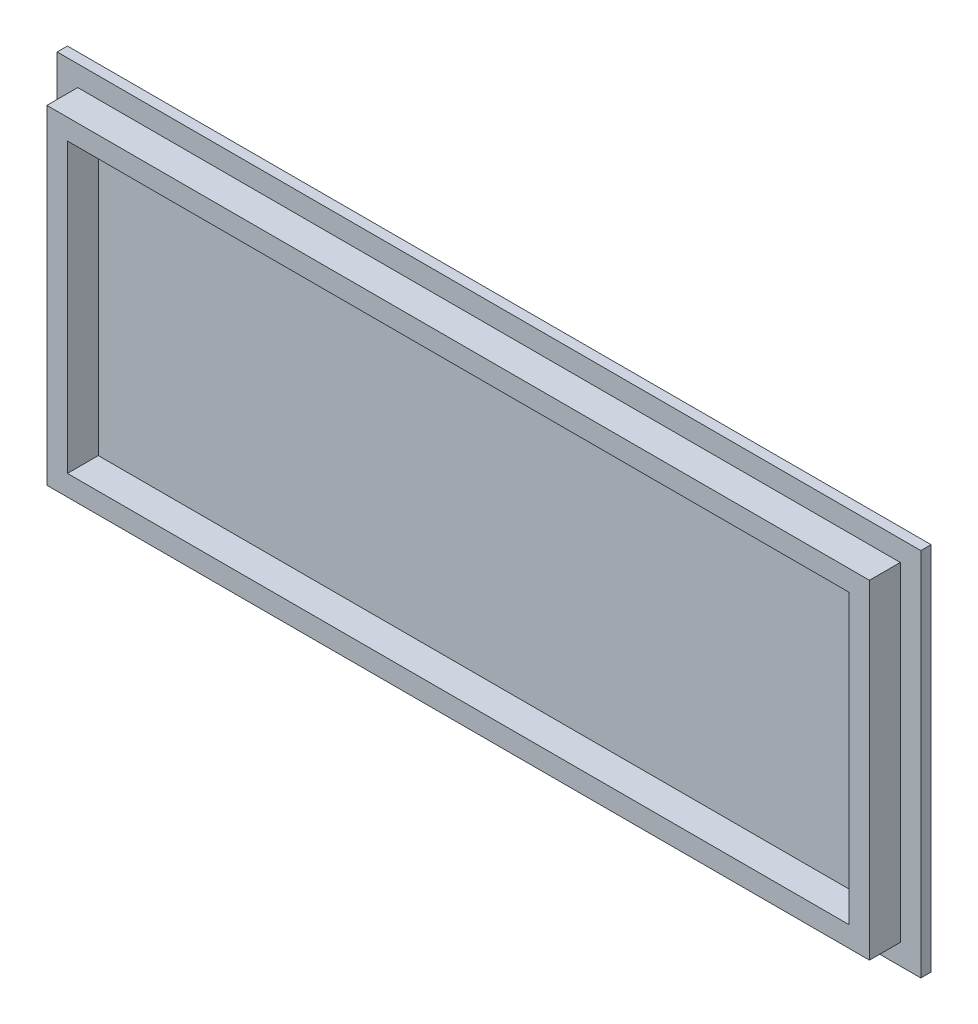
ISO-10303-21;
HEADER;
FILE_DESCRIPTION(('STEP AP214'),'2;1');
FILE_NAME('part.step','',(''),(''),'','','');
FILE_SCHEMA(('AUTOMOTIVE_DESIGN { 1 0 10303 214 1 1 1 1 }'));
ENDSEC;
DATA;
#1=APPLICATION_CONTEXT('core data for automotive mechanical design processes');
#2=APPLICATION_PROTOCOL_DEFINITION('international standard','automotive_design',2000,#1);
#3=PRODUCT_CONTEXT('',#1,'mechanical');
#4=PRODUCT('Part','Part','',(#3));
#5=PRODUCT_RELATED_PRODUCT_CATEGORY('part','',(#4));
#6=PRODUCT_DEFINITION_FORMATION('','',#4);
#7=PRODUCT_DEFINITION_CONTEXT('part definition',#1,'design');
#8=PRODUCT_DEFINITION('design','',#6,#7);
#9=PRODUCT_DEFINITION_SHAPE('','',#8);
#10=(LENGTH_UNIT() NAMED_UNIT(*) SI_UNIT(.MILLI.,.METRE.));
#11=(NAMED_UNIT(*) PLANE_ANGLE_UNIT() SI_UNIT($,.RADIAN.));
#12=(NAMED_UNIT(*) SI_UNIT($,.STERADIAN.) SOLID_ANGLE_UNIT());
#13=UNCERTAINTY_MEASURE_WITH_UNIT(LENGTH_MEASURE(1.E-05),#10,'distance_accuracy_value','');
#14=(GEOMETRIC_REPRESENTATION_CONTEXT(3) GLOBAL_UNCERTAINTY_ASSIGNED_CONTEXT((#13)) GLOBAL_UNIT_ASSIGNED_CONTEXT((#10,
#11,#12)) REPRESENTATION_CONTEXT('',''));
#15=CARTESIAN_POINT('',(0.,0.,0.));
#16=DIRECTION('',(0.,0.,1.));
#17=DIRECTION('',(1.,0.,0.));
#18=AXIS2_PLACEMENT_3D('',#15,#16,#17);
#19=CARTESIAN_POINT('',(0.,0.,1.));
#20=DIRECTION('',(0.,0.,-1.));
#21=DIRECTION('',(-1.,0.,0.));
#22=AXIS2_PLACEMENT_3D('',#19,#20,#21);
#23=PLANE('',#22);
#24=DIRECTION('',(0.,-1.,0.));
#25=VECTOR('',#24,1.);
#26=CARTESIAN_POINT('',(0.,0.,1.));
#27=LINE('',#26,#25);
#28=CARTESIAN_POINT('',(0.,36.,1.));
#29=VERTEX_POINT('',#28);
#30=CARTESIAN_POINT('',(0.,0.,1.));
#31=VERTEX_POINT('',#30);
#32=EDGE_CURVE('E191',#29,#31,#27,.T.);
#33=ORIENTED_EDGE('',*,*,#32,.T.);
#34=DIRECTION('',(1.,0.,0.));
#35=VECTOR('',#34,1.);
#36=CARTESIAN_POINT('',(0.,0.,1.));
#37=LINE('',#36,#35);
#38=CARTESIAN_POINT('',(84.,0.,1.));
#39=VERTEX_POINT('',#38);
#40=EDGE_CURVE('E194',#31,#39,#37,.T.);
#41=ORIENTED_EDGE('',*,*,#40,.T.);
#42=DIRECTION('',(0.,1.,0.));
#43=VECTOR('',#42,1.);
#44=CARTESIAN_POINT('',(84.,0.,1.));
#45=LINE('',#44,#43);
#46=CARTESIAN_POINT('',(84.,36.,1.));
#47=VERTEX_POINT('',#46);
#48=EDGE_CURVE('E197',#39,#47,#45,.T.);
#49=ORIENTED_EDGE('',*,*,#48,.T.);
#50=DIRECTION('',(-1.,0.,0.));
#51=VECTOR('',#50,1.);
#52=CARTESIAN_POINT('',(0.,36.,1.));
#53=LINE('',#52,#51);
#54=EDGE_CURVE('E199',#47,#29,#53,.T.);
#55=ORIENTED_EDGE('',*,*,#54,.T.);
#56=EDGE_LOOP('',(#33,#41,#49,#55));
#57=FACE_BOUND('',#56,.T.);
#58=DIRECTION('',(0.,1.,0.));
#59=VECTOR('',#58,1.);
#60=CARTESIAN_POINT('',(82.,2.,1.));
#61=LINE('',#60,#59);
#62=CARTESIAN_POINT('',(82.,2.,1.));
#63=VERTEX_POINT('',#62);
#64=CARTESIAN_POINT('',(82.,34.,1.));
#65=VERTEX_POINT('',#64);
#66=EDGE_CURVE('E139',#63,#65,#61,.T.);
#67=ORIENTED_EDGE('',*,*,#66,.F.);
#68=DIRECTION('',(1.,0.,0.));
#69=VECTOR('',#68,1.);
#70=CARTESIAN_POINT('',(2.,2.,1.));
#71=LINE('',#70,#69);
#72=CARTESIAN_POINT('',(2.,2.,1.));
#73=VERTEX_POINT('',#72);
#74=EDGE_CURVE('E167',#73,#63,#71,.T.);
#75=ORIENTED_EDGE('',*,*,#74,.F.);
#76=DIRECTION('',(0.,-1.,0.));
#77=VECTOR('',#76,1.);
#78=CARTESIAN_POINT('',(2.,2.,1.));
#79=LINE('',#78,#77);
#80=CARTESIAN_POINT('',(2.,34.,1.));
#81=VERTEX_POINT('',#80);
#82=EDGE_CURVE('E53',#81,#73,#79,.T.);
#83=ORIENTED_EDGE('',*,*,#82,.F.);
#84=DIRECTION('',(-1.,0.,0.));
#85=VECTOR('',#84,1.);
#86=CARTESIAN_POINT('',(2.,34.,1.));
#87=LINE('',#86,#85);
#88=EDGE_CURVE('E48',#65,#81,#87,.T.);
#89=ORIENTED_EDGE('',*,*,#88,.F.);
#90=EDGE_LOOP('',(#67,#75,#83,#89));
#91=FACE_BOUND('',#90,.T.);
#92=ADVANCED_FACE('F33',(#57,#91),#23,.F.);
#93=CARTESIAN_POINT('',(0.,0.,1.));
#94=DIRECTION('',(1.,0.,0.));
#95=DIRECTION('',(0.,0.,-1.));
#96=AXIS2_PLACEMENT_3D('',#93,#94,#95);
#97=PLANE('',#96);
#98=DIRECTION('',(0.,-1.,0.));
#99=VECTOR('',#98,1.);
#100=CARTESIAN_POINT('',(0.,0.,0.));
#101=LINE('',#100,#99);
#102=CARTESIAN_POINT('',(0.,36.,0.));
#103=VERTEX_POINT('',#102);
#104=CARTESIAN_POINT('',(0.,0.,0.));
#105=VERTEX_POINT('',#104);
#106=EDGE_CURVE('E190',#103,#105,#101,.T.);
#107=ORIENTED_EDGE('',*,*,#106,.T.);
#108=DIRECTION('',(0.,0.,-1.));
#109=VECTOR('',#108,1.);
#110=CARTESIAN_POINT('',(0.,0.,1.));
#111=LINE('',#110,#109);
#112=EDGE_CURVE('E11',#31,#105,#111,.T.);
#113=ORIENTED_EDGE('',*,*,#112,.F.);
#114=ORIENTED_EDGE('',*,*,#32,.F.);
#115=DIRECTION('',(0.,0.,-1.));
#116=VECTOR('',#115,1.);
#117=CARTESIAN_POINT('',(0.,36.,1.));
#118=LINE('',#117,#116);
#119=EDGE_CURVE('E201',#29,#103,#118,.T.);
#120=ORIENTED_EDGE('',*,*,#119,.T.);
#121=EDGE_LOOP('',(#107,#113,#114,#120));
#122=FACE_BOUND('',#121,.T.);
#123=ADVANCED_FACE('F35',(#122),#97,.F.);
#124=CARTESIAN_POINT('',(0.,0.,1.));
#125=DIRECTION('',(0.,1.,0.));
#126=DIRECTION('',(0.,0.,1.));
#127=AXIS2_PLACEMENT_3D('',#124,#125,#126);
#128=PLANE('',#127);
#129=DIRECTION('',(1.,0.,0.));
#130=VECTOR('',#129,1.);
#131=CARTESIAN_POINT('',(0.,0.,0.));
#132=LINE('',#131,#130);
#133=CARTESIAN_POINT('',(84.,0.,0.));
#134=VERTEX_POINT('',#133);
#135=EDGE_CURVE('E204',#105,#134,#132,.T.);
#136=ORIENTED_EDGE('',*,*,#135,.T.);
#137=DIRECTION('',(0.,0.,-1.));
#138=VECTOR('',#137,1.);
#139=CARTESIAN_POINT('',(84.,0.,1.));
#140=LINE('',#139,#138);
#141=EDGE_CURVE('E41',#39,#134,#140,.T.);
#142=ORIENTED_EDGE('',*,*,#141,.F.);
#143=ORIENTED_EDGE('',*,*,#40,.F.);
#144=ORIENTED_EDGE('',*,*,#112,.T.);
#145=EDGE_LOOP('',(#136,#142,#143,#144));
#146=FACE_BOUND('',#145,.T.);
#147=ADVANCED_FACE('F233',(#146),#128,.F.);
#148=CARTESIAN_POINT('',(84.,0.,1.));
#149=DIRECTION('',(-1.,0.,0.));
#150=DIRECTION('',(0.,0.,1.));
#151=AXIS2_PLACEMENT_3D('',#148,#149,#150);
#152=PLANE('',#151);
#153=DIRECTION('',(0.,1.,0.));
#154=VECTOR('',#153,1.);
#155=CARTESIAN_POINT('',(84.,0.,0.));
#156=LINE('',#155,#154);
#157=CARTESIAN_POINT('',(84.,36.,0.));
#158=VERTEX_POINT('',#157);
#159=EDGE_CURVE('E206',#134,#158,#156,.T.);
#160=ORIENTED_EDGE('',*,*,#159,.T.);
#161=DIRECTION('',(0.,0.,-1.));
#162=VECTOR('',#161,1.);
#163=CARTESIAN_POINT('',(84.,36.,1.));
#164=LINE('',#163,#162);
#165=EDGE_CURVE('E211',#47,#158,#164,.T.);
#166=ORIENTED_EDGE('',*,*,#165,.F.);
#167=ORIENTED_EDGE('',*,*,#48,.F.);
#168=ORIENTED_EDGE('',*,*,#141,.T.);
#169=EDGE_LOOP('',(#160,#166,#167,#168));
#170=FACE_BOUND('',#169,.T.);
#171=ADVANCED_FACE('F218',(#170),#152,.F.);
#172=CARTESIAN_POINT('',(0.,36.,1.));
#173=DIRECTION('',(0.,-1.,0.));
#174=DIRECTION('',(0.,0.,-1.));
#175=AXIS2_PLACEMENT_3D('',#172,#173,#174);
#176=PLANE('',#175);
#177=DIRECTION('',(-1.,0.,0.));
#178=VECTOR('',#177,1.);
#179=CARTESIAN_POINT('',(0.,36.,0.));
#180=LINE('',#179,#178);
#181=EDGE_CURVE('E195',#158,#103,#180,.T.);
#182=ORIENTED_EDGE('',*,*,#181,.T.);
#183=ORIENTED_EDGE('',*,*,#119,.F.);
#184=ORIENTED_EDGE('',*,*,#54,.F.);
#185=ORIENTED_EDGE('',*,*,#165,.T.);
#186=EDGE_LOOP('',(#182,#183,#184,#185));
#187=FACE_BOUND('',#186,.T.);
#188=ADVANCED_FACE('F227',(#187),#176,.F.);
#189=CARTESIAN_POINT('',(0.,0.,0.));
#190=DIRECTION('',(0.,0.,-1.));
#191=DIRECTION('',(-1.,0.,0.));
#192=AXIS2_PLACEMENT_3D('',#189,#190,#191);
#193=PLANE('',#192);
#194=ORIENTED_EDGE('',*,*,#106,.F.);
#195=ORIENTED_EDGE('',*,*,#181,.F.);
#196=ORIENTED_EDGE('',*,*,#159,.F.);
#197=ORIENTED_EDGE('',*,*,#135,.F.);
#198=EDGE_LOOP('',(#194,#195,#196,#197));
#199=FACE_BOUND('',#198,.T.);
#200=ADVANCED_FACE('F224',(#199),#193,.T.);
#201=CARTESIAN_POINT('',(0.,0.,4.));
#202=DIRECTION('',(0.,0.,-1.));
#203=DIRECTION('',(-1.,0.,0.));
#204=AXIS2_PLACEMENT_3D('',#201,#202,#203);
#205=PLANE('',#204);
#206=DIRECTION('',(0.,1.,0.));
#207=VECTOR('',#206,1.);
#208=CARTESIAN_POINT('',(82.,2.,4.));
#209=LINE('',#208,#207);
#210=CARTESIAN_POINT('',(82.,2.,4.));
#211=VERTEX_POINT('',#210);
#212=CARTESIAN_POINT('',(82.,34.,4.));
#213=VERTEX_POINT('',#212);
#214=EDGE_CURVE('E163',#211,#213,#209,.T.);
#215=ORIENTED_EDGE('',*,*,#214,.T.);
#216=DIRECTION('',(-1.,0.,0.));
#217=VECTOR('',#216,1.);
#218=CARTESIAN_POINT('',(2.,34.,4.));
#219=LINE('',#218,#217);
#220=CARTESIAN_POINT('',(2.,34.,4.));
#221=VERTEX_POINT('',#220);
#222=EDGE_CURVE('E166',#213,#221,#219,.T.);
#223=ORIENTED_EDGE('',*,*,#222,.T.);
#224=DIRECTION('',(0.,-1.,0.));
#225=VECTOR('',#224,1.);
#226=CARTESIAN_POINT('',(2.,2.,4.));
#227=LINE('',#226,#225);
#228=CARTESIAN_POINT('',(2.,2.,4.));
#229=VERTEX_POINT('',#228);
#230=EDGE_CURVE('E169',#221,#229,#227,.T.);
#231=ORIENTED_EDGE('',*,*,#230,.T.);
#232=DIRECTION('',(1.,0.,0.));
#233=VECTOR('',#232,1.);
#234=CARTESIAN_POINT('',(2.,2.,4.));
#235=LINE('',#234,#233);
#236=EDGE_CURVE('E171',#229,#211,#235,.T.);
#237=ORIENTED_EDGE('',*,*,#236,.T.);
#238=EDGE_LOOP('',(#215,#223,#231,#237));
#239=FACE_BOUND('',#238,.T.);
#240=DIRECTION('',(0.,-1.,0.));
#241=VECTOR('',#240,1.);
#242=CARTESIAN_POINT('',(4.,4.,4.));
#243=LINE('',#242,#241);
#244=CARTESIAN_POINT('',(4.,32.,4.));
#245=VERTEX_POINT('',#244);
#246=CARTESIAN_POINT('',(4.,4.,4.));
#247=VERTEX_POINT('',#246);
#248=EDGE_CURVE('E121',#245,#247,#243,.T.);
#249=ORIENTED_EDGE('',*,*,#248,.F.);
#250=DIRECTION('',(-1.,0.,0.));
#251=VECTOR('',#250,1.);
#252=CARTESIAN_POINT('',(4.,32.,4.));
#253=LINE('',#252,#251);
#254=CARTESIAN_POINT('',(80.,32.,4.));
#255=VERTEX_POINT('',#254);
#256=EDGE_CURVE('E147',#255,#245,#253,.T.);
#257=ORIENTED_EDGE('',*,*,#256,.F.);
#258=DIRECTION('',(0.,1.,0.));
#259=VECTOR('',#258,1.);
#260=CARTESIAN_POINT('',(80.,4.,4.));
#261=LINE('',#260,#259);
#262=CARTESIAN_POINT('',(80.,4.,4.));
#263=VERTEX_POINT('',#262);
#264=EDGE_CURVE('E145',#263,#255,#261,.T.);
#265=ORIENTED_EDGE('',*,*,#264,.F.);
#266=DIRECTION('',(1.,0.,0.));
#267=VECTOR('',#266,1.);
#268=CARTESIAN_POINT('',(4.,4.,4.));
#269=LINE('',#268,#267);
#270=EDGE_CURVE('E131',#247,#263,#269,.T.);
#271=ORIENTED_EDGE('',*,*,#270,.F.);
#272=EDGE_LOOP('',(#249,#257,#265,#271));
#273=FACE_BOUND('',#272,.T.);
#274=ADVANCED_FACE('F143',(#239,#273),#205,.F.);
#275=CARTESIAN_POINT('',(82.,2.,4.));
#276=DIRECTION('',(-1.,0.,0.));
#277=DIRECTION('',(0.,0.,1.));
#278=AXIS2_PLACEMENT_3D('',#275,#276,#277);
#279=PLANE('',#278);
#280=ORIENTED_EDGE('',*,*,#66,.T.);
#281=DIRECTION('',(0.,0.,-1.));
#282=VECTOR('',#281,1.);
#283=CARTESIAN_POINT('',(82.,34.,4.));
#284=LINE('',#283,#282);
#285=EDGE_CURVE('E188',#213,#65,#284,.T.);
#286=ORIENTED_EDGE('',*,*,#285,.F.);
#287=ORIENTED_EDGE('',*,*,#214,.F.);
#288=DIRECTION('',(0.,0.,-1.));
#289=VECTOR('',#288,1.);
#290=CARTESIAN_POINT('',(82.,2.,4.));
#291=LINE('',#290,#289);
#292=EDGE_CURVE('E173',#211,#63,#291,.T.);
#293=ORIENTED_EDGE('',*,*,#292,.T.);
#294=EDGE_LOOP('',(#280,#286,#287,#293));
#295=FACE_BOUND('',#294,.T.);
#296=ADVANCED_FACE('F271',(#295),#279,.F.);
#297=CARTESIAN_POINT('',(2.,34.,4.));
#298=DIRECTION('',(0.,-1.,0.));
#299=DIRECTION('',(0.,0.,-1.));
#300=AXIS2_PLACEMENT_3D('',#297,#298,#299);
#301=PLANE('',#300);
#302=ORIENTED_EDGE('',*,*,#88,.T.);
#303=DIRECTION('',(0.,0.,-1.));
#304=VECTOR('',#303,1.);
#305=CARTESIAN_POINT('',(2.,34.,4.));
#306=LINE('',#305,#304);
#307=EDGE_CURVE('E185',#221,#81,#306,.T.);
#308=ORIENTED_EDGE('',*,*,#307,.F.);
#309=ORIENTED_EDGE('',*,*,#222,.F.);
#310=ORIENTED_EDGE('',*,*,#285,.T.);
#311=EDGE_LOOP('',(#302,#308,#309,#310));
#312=FACE_BOUND('',#311,.T.);
#313=ADVANCED_FACE('F279',(#312),#301,.F.);
#314=CARTESIAN_POINT('',(2.,2.,4.));
#315=DIRECTION('',(1.,0.,0.));
#316=DIRECTION('',(0.,0.,-1.));
#317=AXIS2_PLACEMENT_3D('',#314,#315,#316);
#318=PLANE('',#317);
#319=ORIENTED_EDGE('',*,*,#82,.T.);
#320=DIRECTION('',(0.,0.,-1.));
#321=VECTOR('',#320,1.);
#322=CARTESIAN_POINT('',(2.,2.,4.));
#323=LINE('',#322,#321);
#324=EDGE_CURVE('E182',#229,#73,#323,.T.);
#325=ORIENTED_EDGE('',*,*,#324,.F.);
#326=ORIENTED_EDGE('',*,*,#230,.F.);
#327=ORIENTED_EDGE('',*,*,#307,.T.);
#328=EDGE_LOOP('',(#319,#325,#326,#327));
#329=FACE_BOUND('',#328,.T.);
#330=ADVANCED_FACE('F275',(#329),#318,.F.);
#331=CARTESIAN_POINT('',(2.,2.,4.));
#332=DIRECTION('',(0.,1.,0.));
#333=DIRECTION('',(0.,0.,1.));
#334=AXIS2_PLACEMENT_3D('',#331,#332,#333);
#335=PLANE('',#334);
#336=ORIENTED_EDGE('',*,*,#74,.T.);
#337=ORIENTED_EDGE('',*,*,#292,.F.);
#338=ORIENTED_EDGE('',*,*,#236,.F.);
#339=ORIENTED_EDGE('',*,*,#324,.T.);
#340=EDGE_LOOP('',(#336,#337,#338,#339));
#341=FACE_BOUND('',#340,.T.);
#342=ADVANCED_FACE('F268',(#341),#335,.F.);
#343=CARTESIAN_POINT('',(4.,4.,4.));
#344=DIRECTION('',(1.,0.,0.));
#345=DIRECTION('',(0.,0.,-1.));
#346=AXIS2_PLACEMENT_3D('',#343,#344,#345);
#347=PLANE('',#346);
#348=DIRECTION('',(0.,-1.,0.));
#349=VECTOR('',#348,1.);
#350=CARTESIAN_POINT('',(4.,4.,1.));
#351=LINE('',#350,#349);
#352=CARTESIAN_POINT('',(4.,32.,1.));
#353=VERTEX_POINT('',#352);
#354=CARTESIAN_POINT('',(4.,4.,1.));
#355=VERTEX_POINT('',#354);
#356=EDGE_CURVE('E151',#353,#355,#351,.T.);
#357=ORIENTED_EDGE('',*,*,#356,.F.);
#358=DIRECTION('',(0.,0.,-1.));
#359=VECTOR('',#358,1.);
#360=CARTESIAN_POINT('',(4.,32.,4.));
#361=LINE('',#360,#359);
#362=EDGE_CURVE('E127',#245,#353,#361,.T.);
#363=ORIENTED_EDGE('',*,*,#362,.F.);
#364=ORIENTED_EDGE('',*,*,#248,.T.);
#365=DIRECTION('',(0.,0.,-1.));
#366=VECTOR('',#365,1.);
#367=CARTESIAN_POINT('',(4.,4.,4.));
#368=LINE('',#367,#366);
#369=EDGE_CURVE('E125',#247,#355,#368,.T.);
#370=ORIENTED_EDGE('',*,*,#369,.T.);
#371=EDGE_LOOP('',(#357,#363,#364,#370));
#372=FACE_BOUND('',#371,.T.);
#373=ADVANCED_FACE('F124',(#372),#347,.T.);
#374=CARTESIAN_POINT('',(4.,4.,4.));
#375=DIRECTION('',(0.,1.,0.));
#376=DIRECTION('',(0.,0.,1.));
#377=AXIS2_PLACEMENT_3D('',#374,#375,#376);
#378=PLANE('',#377);
#379=DIRECTION('',(1.,0.,0.));
#380=VECTOR('',#379,1.);
#381=CARTESIAN_POINT('',(4.,4.,1.));
#382=LINE('',#381,#380);
#383=CARTESIAN_POINT('',(80.,4.,1.));
#384=VERTEX_POINT('',#383);
#385=EDGE_CURVE('E138',#355,#384,#382,.T.);
#386=ORIENTED_EDGE('',*,*,#385,.F.);
#387=ORIENTED_EDGE('',*,*,#369,.F.);
#388=ORIENTED_EDGE('',*,*,#270,.T.);
#389=DIRECTION('',(0.,0.,-1.));
#390=VECTOR('',#389,1.);
#391=CARTESIAN_POINT('',(80.,4.,4.));
#392=LINE('',#391,#390);
#393=EDGE_CURVE('E140',#263,#384,#392,.T.);
#394=ORIENTED_EDGE('',*,*,#393,.T.);
#395=EDGE_LOOP('',(#386,#387,#388,#394));
#396=FACE_BOUND('',#395,.T.);
#397=ADVANCED_FACE('F135',(#396),#378,.T.);
#398=CARTESIAN_POINT('',(80.,4.,4.));
#399=DIRECTION('',(-1.,0.,0.));
#400=DIRECTION('',(0.,0.,1.));
#401=AXIS2_PLACEMENT_3D('',#398,#399,#400);
#402=PLANE('',#401);
#403=DIRECTION('',(0.,1.,0.));
#404=VECTOR('',#403,1.);
#405=CARTESIAN_POINT('',(80.,4.,1.));
#406=LINE('',#405,#404);
#407=CARTESIAN_POINT('',(80.,32.,1.));
#408=VERTEX_POINT('',#407);
#409=EDGE_CURVE('E154',#384,#408,#406,.T.);
#410=ORIENTED_EDGE('',*,*,#409,.F.);
#411=ORIENTED_EDGE('',*,*,#393,.F.);
#412=ORIENTED_EDGE('',*,*,#264,.T.);
#413=DIRECTION('',(0.,0.,-1.));
#414=VECTOR('',#413,1.);
#415=CARTESIAN_POINT('',(80.,32.,4.));
#416=LINE('',#415,#414);
#417=EDGE_CURVE('E160',#255,#408,#416,.T.);
#418=ORIENTED_EDGE('',*,*,#417,.T.);
#419=EDGE_LOOP('',(#410,#411,#412,#418));
#420=FACE_BOUND('',#419,.T.);
#421=ADVANCED_FACE('F253',(#420),#402,.T.);
#422=CARTESIAN_POINT('',(4.,32.,4.));
#423=DIRECTION('',(0.,-1.,0.));
#424=DIRECTION('',(0.,0.,-1.));
#425=AXIS2_PLACEMENT_3D('',#422,#423,#424);
#426=PLANE('',#425);
#427=DIRECTION('',(-1.,0.,0.));
#428=VECTOR('',#427,1.);
#429=CARTESIAN_POINT('',(4.,32.,1.));
#430=LINE('',#429,#428);
#431=EDGE_CURVE('E132',#408,#353,#430,.T.);
#432=ORIENTED_EDGE('',*,*,#431,.F.);
#433=ORIENTED_EDGE('',*,*,#417,.F.);
#434=ORIENTED_EDGE('',*,*,#256,.T.);
#435=ORIENTED_EDGE('',*,*,#362,.T.);
#436=EDGE_LOOP('',(#432,#433,#434,#435));
#437=FACE_BOUND('',#436,.T.);
#438=ADVANCED_FACE('F248',(#437),#426,.T.);
#439=ORIENTED_EDGE('',*,*,#431,.T.);
#440=ORIENTED_EDGE('',*,*,#356,.T.);
#441=ORIENTED_EDGE('',*,*,#385,.T.);
#442=ORIENTED_EDGE('',*,*,#409,.T.);
#443=EDGE_LOOP('',(#439,#440,#441,#442));
#444=FACE_BOUND('',#443,.T.);
#445=ADVANCED_FACE('F242',(#444),#23,.F.);
#446=CLOSED_SHELL('',(#92,#123,#147,#171,#188,#200,#274,#296,#313,#330,#342,#373,#397,#421,#438,#445));
#447=MANIFOLD_SOLID_BREP('B2',#446);
#448=ADVANCED_BREP_SHAPE_REPRESENTATION('',(#18,#447),#14);
#449=SHAPE_DEFINITION_REPRESENTATION(#9,#448);
ENDSEC;
END-ISO-10303-21;
